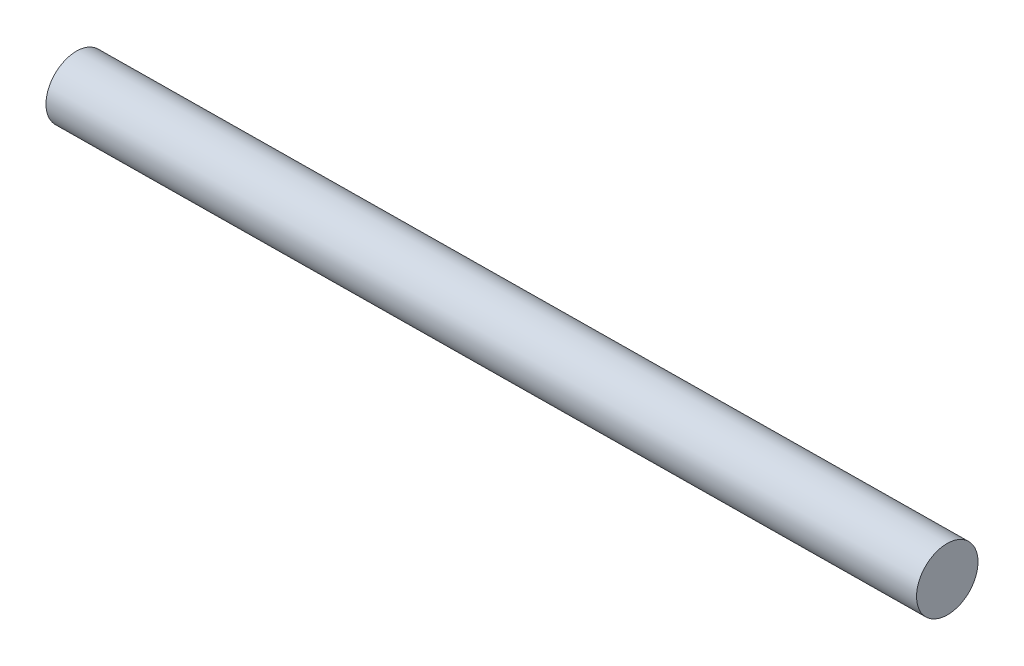
ISO-10303-21;
HEADER;
FILE_DESCRIPTION(('STEP AP214'),'2;1');
FILE_NAME('part.step','',(''),(''),'','','');
FILE_SCHEMA(('AUTOMOTIVE_DESIGN { 1 0 10303 214 1 1 1 1 }'));
ENDSEC;
DATA;
#1=APPLICATION_CONTEXT('core data for automotive mechanical design processes');
#2=APPLICATION_PROTOCOL_DEFINITION('international standard','automotive_design',2000,#1);
#3=PRODUCT_CONTEXT('',#1,'mechanical');
#4=PRODUCT('Part','Part','',(#3));
#5=PRODUCT_RELATED_PRODUCT_CATEGORY('part','',(#4));
#6=PRODUCT_DEFINITION_FORMATION('','',#4);
#7=PRODUCT_DEFINITION_CONTEXT('part definition',#1,'design');
#8=PRODUCT_DEFINITION('design','',#6,#7);
#9=PRODUCT_DEFINITION_SHAPE('','',#8);
#10=(LENGTH_UNIT() NAMED_UNIT(*) SI_UNIT(.MILLI.,.METRE.));
#11=(NAMED_UNIT(*) PLANE_ANGLE_UNIT() SI_UNIT($,.RADIAN.));
#12=(NAMED_UNIT(*) SI_UNIT($,.STERADIAN.) SOLID_ANGLE_UNIT());
#13=UNCERTAINTY_MEASURE_WITH_UNIT(LENGTH_MEASURE(1.E-05),#10,'distance_accuracy_value','');
#14=(GEOMETRIC_REPRESENTATION_CONTEXT(3) GLOBAL_UNCERTAINTY_ASSIGNED_CONTEXT((#13)) GLOBAL_UNIT_ASSIGNED_CONTEXT((#10,
#11,#12)) REPRESENTATION_CONTEXT('',''));
#15=CARTESIAN_POINT('',(0.,0.,0.));
#16=DIRECTION('',(0.,0.,1.));
#17=DIRECTION('',(1.,0.,0.));
#18=AXIS2_PLACEMENT_3D('',#15,#16,#17);
#19=CARTESIAN_POINT('',(0.,0.,0.));
#20=DIRECTION('',(0.999948086562843,0.0101894150621294,0.));
#21=DIRECTION('',(-0.0101894150621294,0.999948086562843,0.));
#22=AXIS2_PLACEMENT_3D('',#19,#20,#21);
#23=PLANE('',#22);
#24=CARTESIAN_POINT('',(0.,0.,0.));
#25=DIRECTION('',(0.999948086562843,0.0101894150621294,0.));
#26=DIRECTION('',(-0.0101894150621294,0.999948086562843,0.));
#27=AXIS2_PLACEMENT_3D('',#24,#25,#26);
#28=CIRCLE('',#27,9.);
#29=CARTESIAN_POINT('',(-0.0917047355591647,8.99953277906559,0.));
#30=VERTEX_POINT('',#29);
#31=EDGE_CURVE('E47',#30,#30,#28,.T.);
#32=ORIENTED_EDGE('',*,*,#31,.F.);
#33=EDGE_LOOP('',(#32));
#34=FACE_BOUND('',#33,.T.);
#35=ADVANCED_FACE('F40',(#34),#23,.F.);
#36=CARTESIAN_POINT('',(255.,2.59843573457321,0.));
#37=DIRECTION('',(0.999948086562843,0.0101894150621294,0.));
#38=DIRECTION('',(-0.0101894150621294,0.999948086562843,0.));
#39=AXIS2_PLACEMENT_3D('',#36,#37,#38);
#40=PLANE('',#39);
#41=CARTESIAN_POINT('',(255.,2.59843573457321,0.));
#42=DIRECTION('',(0.999948086562843,0.0101894150621294,0.));
#43=DIRECTION('',(-0.0101894150621294,0.999948086562843,0.));
#44=AXIS2_PLACEMENT_3D('',#41,#42,#43);
#45=CIRCLE('',#44,9.);
#46=CARTESIAN_POINT('',(254.908295264441,11.5979685136388,0.));
#47=VERTEX_POINT('',#46);
#48=EDGE_CURVE('E12',#47,#47,#45,.T.);
#49=ORIENTED_EDGE('',*,*,#48,.T.);
#50=EDGE_LOOP('',(#49));
#51=FACE_BOUND('',#50,.T.);
#52=ADVANCED_FACE('F54',(#51),#40,.T.);
#53=CARTESIAN_POINT('',(0.,0.,0.));
#54=DIRECTION('',(0.999948086562843,0.0101894150621294,0.));
#55=DIRECTION('',(-0.0101894150621294,0.999948086562843,0.));
#56=AXIS2_PLACEMENT_3D('',#53,#54,#55);
#57=CYLINDRICAL_SURFACE('',#56,9.);
#58=ORIENTED_EDGE('',*,*,#48,.F.);
#59=EDGE_LOOP('',(#58));
#60=FACE_BOUND('',#59,.T.);
#61=ORIENTED_EDGE('',*,*,#31,.T.);
#62=EDGE_LOOP('',(#61));
#63=FACE_BOUND('',#62,.T.);
#64=ADVANCED_FACE('F56',(#60,#63),#57,.T.);
#65=CLOSED_SHELL('',(#35,#52,#64));
#66=MANIFOLD_SOLID_BREP('B2',#65);
#67=ADVANCED_BREP_SHAPE_REPRESENTATION('',(#18,#66),#14);
#68=SHAPE_DEFINITION_REPRESENTATION(#9,#67);
ENDSEC;
END-ISO-10303-21;
